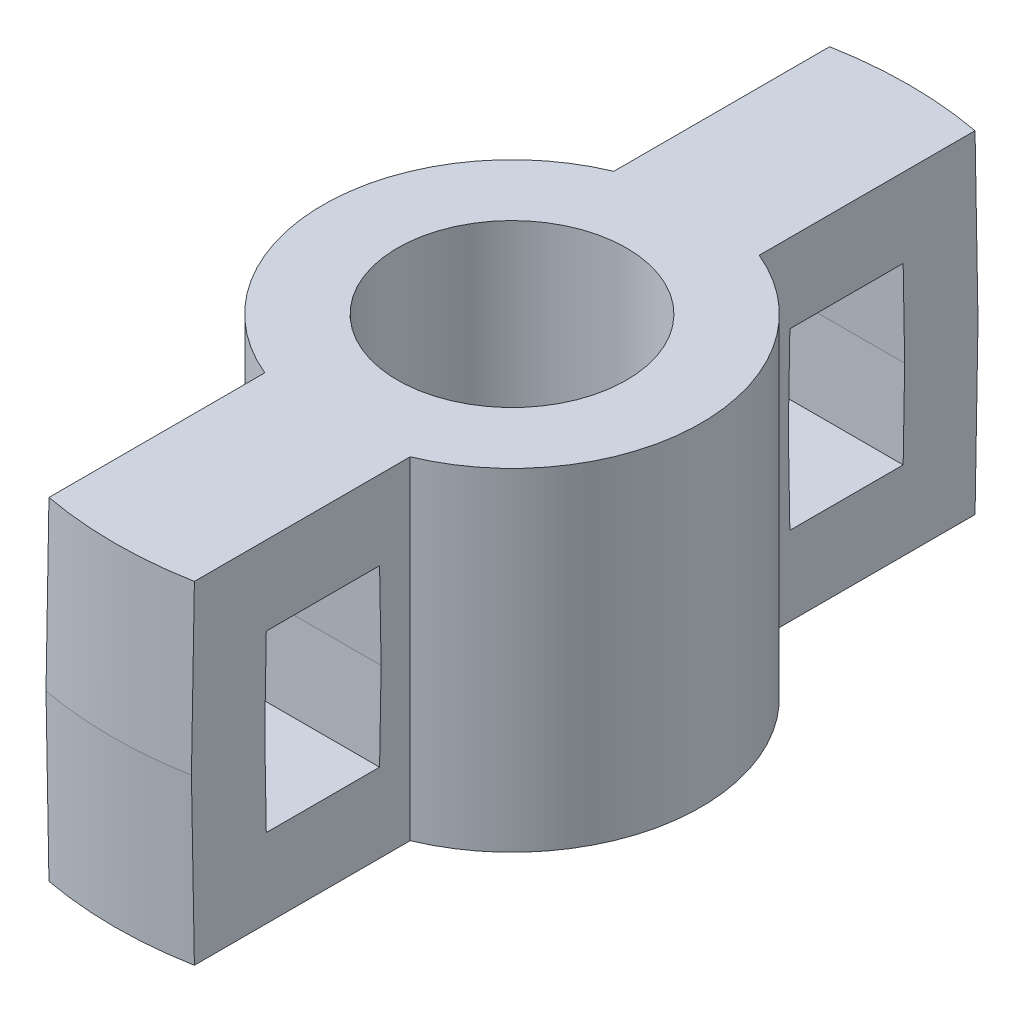
ISO-10303-21;
HEADER;
FILE_DESCRIPTION(('STEP AP214'),'2;1');
FILE_NAME('part.step','',(''),(''),'','','');
FILE_SCHEMA(('AUTOMOTIVE_DESIGN { 1 0 10303 214 1 1 1 1 }'));
ENDSEC;
DATA;
#1=APPLICATION_CONTEXT('core data for automotive mechanical design processes');
#2=APPLICATION_PROTOCOL_DEFINITION('international standard','automotive_design',2000,#1);
#3=PRODUCT_CONTEXT('',#1,'mechanical');
#4=PRODUCT('Part','Part','',(#3));
#5=PRODUCT_RELATED_PRODUCT_CATEGORY('part','',(#4));
#6=PRODUCT_DEFINITION_FORMATION('','',#4);
#7=PRODUCT_DEFINITION_CONTEXT('part definition',#1,'design');
#8=PRODUCT_DEFINITION('design','',#6,#7);
#9=PRODUCT_DEFINITION_SHAPE('','',#8);
#10=(LENGTH_UNIT() NAMED_UNIT(*) SI_UNIT(.MILLI.,.METRE.));
#11=(NAMED_UNIT(*) PLANE_ANGLE_UNIT() SI_UNIT($,.RADIAN.));
#12=(NAMED_UNIT(*) SI_UNIT($,.STERADIAN.) SOLID_ANGLE_UNIT());
#13=UNCERTAINTY_MEASURE_WITH_UNIT(LENGTH_MEASURE(1.E-05),#10,'distance_accuracy_value','');
#14=(GEOMETRIC_REPRESENTATION_CONTEXT(3) GLOBAL_UNCERTAINTY_ASSIGNED_CONTEXT((#13)) GLOBAL_UNIT_ASSIGNED_CONTEXT((#10,
#11,#12)) REPRESENTATION_CONTEXT('',''));
#15=CARTESIAN_POINT('',(0.,0.,0.));
#16=DIRECTION('',(0.,0.,1.));
#17=DIRECTION('',(1.,0.,0.));
#18=AXIS2_PLACEMENT_3D('',#15,#16,#17);
#19=CARTESIAN_POINT('',(-2.6,1.2,-4.37905392208613));
#20=DIRECTION('',(0.,0.0174524064372886,-0.999847695156391));
#21=DIRECTION('',(0.,0.999847695156391,0.0174524064372886));
#22=AXIS2_PLACEMENT_3D('',#19,#20,#21);
#23=PLANE('',#22);
#24=DIRECTION('',(1.,0.,0.));
#25=VECTOR('',#24,1.);
#26=CARTESIAN_POINT('',(-2.6,1.2,-4.37905392208613));
#27=LINE('',#26,#25);
#28=CARTESIAN_POINT('',(0.999999999999999,1.2,-4.37905392208613));
#29=VERTEX_POINT('',#28);
#30=CARTESIAN_POINT('',(-1.,1.2,-4.37905392208613));
#31=VERTEX_POINT('',#30);
#32=EDGE_CURVE('E300',#29,#31,#27,.F.);
#33=ORIENTED_EDGE('',*,*,#32,.T.);
#34=DIRECTION('',(0.,0.999847695156391,0.0174524064372886));
#35=VECTOR('',#34,1.);
#36=CARTESIAN_POINT('',(-1.,1.2,-4.37905392208613));
#37=LINE('',#36,#35);
#38=CARTESIAN_POINT('',(-1.,0.,-4.4));
#39=VERTEX_POINT('',#38);
#40=EDGE_CURVE('E328',#39,#31,#37,.T.);
#41=ORIENTED_EDGE('',*,*,#40,.F.);
#42=DIRECTION('',(1.,0.,0.));
#43=VECTOR('',#42,1.);
#44=CARTESIAN_POINT('',(-2.6,0.,-4.4));
#45=LINE('',#44,#43);
#46=CARTESIAN_POINT('',(1.,0.,-4.4));
#47=VERTEX_POINT('',#46);
#48=EDGE_CURVE('E280',#39,#47,#45,.T.);
#49=ORIENTED_EDGE('',*,*,#48,.T.);
#50=DIRECTION('',(0.,0.999847695156391,0.0174524064372886));
#51=VECTOR('',#50,1.);
#52=CARTESIAN_POINT('',(1.,1.2,-4.37905392208613));
#53=LINE('',#52,#51);
#54=EDGE_CURVE('E315',#29,#47,#53,.F.);
#55=ORIENTED_EDGE('',*,*,#54,.F.);
#56=EDGE_LOOP('',(#33,#41,#49,#55));
#57=FACE_BOUND('',#56,.T.);
#58=ADVANCED_FACE('F16',(#57),#23,.F.);
#59=CARTESIAN_POINT('',(-2.6,0.,2.8));
#60=DIRECTION('',(0.,0.0174524064372871,-0.999847695156391));
#61=DIRECTION('',(0.,0.999847695156391,0.0174524064372871));
#62=AXIS2_PLACEMENT_3D('',#59,#60,#61);
#63=PLANE('',#62);
#64=DIRECTION('',(1.,0.,0.));
#65=VECTOR('',#64,1.);
#66=CARTESIAN_POINT('',(-2.6,0.,2.8));
#67=LINE('',#66,#65);
#68=CARTESIAN_POINT('',(-1.,0.,2.8));
#69=VERTEX_POINT('',#68);
#70=CARTESIAN_POINT('',(0.999999999999995,0.,2.8));
#71=VERTEX_POINT('',#70);
#72=EDGE_CURVE('E274',#69,#71,#67,.T.);
#73=ORIENTED_EDGE('',*,*,#72,.T.);
#74=DIRECTION('',(0.,0.999847695156391,0.0174524064372871));
#75=VECTOR('',#74,1.);
#76=CARTESIAN_POINT('',(0.999999999999995,0.,2.8));
#77=LINE('',#76,#75);
#78=CARTESIAN_POINT('',(0.999999999999997,1.2,2.82094607791387));
#79=VERTEX_POINT('',#78);
#80=EDGE_CURVE('E310',#79,#71,#77,.F.);
#81=ORIENTED_EDGE('',*,*,#80,.F.);
#82=DIRECTION('',(1.,0.,0.));
#83=VECTOR('',#82,1.);
#84=CARTESIAN_POINT('',(-2.6,1.2,2.82094607791387));
#85=LINE('',#84,#83);
#86=CARTESIAN_POINT('',(-1.,1.2,2.82094607791387));
#87=VERTEX_POINT('',#86);
#88=EDGE_CURVE('E258',#79,#87,#85,.F.);
#89=ORIENTED_EDGE('',*,*,#88,.T.);
#90=DIRECTION('',(0.,0.999847695156391,0.0174524064372871));
#91=VECTOR('',#90,1.);
#92=CARTESIAN_POINT('',(-1.,0.,2.8));
#93=LINE('',#92,#91);
#94=EDGE_CURVE('E307',#69,#87,#93,.T.);
#95=ORIENTED_EDGE('',*,*,#94,.F.);
#96=EDGE_LOOP('',(#73,#81,#89,#95));
#97=FACE_BOUND('',#96,.T.);
#98=ADVANCED_FACE('F644',(#97),#63,.F.);
#99=CARTESIAN_POINT('',(-2.6,1.2,-2.82094607791387));
#100=DIRECTION('',(0.,1.,0.));
#101=DIRECTION('',(0.,0.,1.));
#102=AXIS2_PLACEMENT_3D('',#99,#100,#101);
#103=PLANE('',#102);
#104=DIRECTION('',(1.,0.,0.));
#105=VECTOR('',#104,1.);
#106=CARTESIAN_POINT('',(-2.6,1.2,-2.82094607791387));
#107=LINE('',#106,#105);
#108=CARTESIAN_POINT('',(0.999999999999996,1.2,-2.82094607791387));
#109=VERTEX_POINT('',#108);
#110=CARTESIAN_POINT('',(-1.,1.2,-2.82094607791387));
#111=VERTEX_POINT('',#110);
#112=EDGE_CURVE('E244',#109,#111,#107,.F.);
#113=ORIENTED_EDGE('',*,*,#112,.T.);
#114=DIRECTION('',(0.,0.,1.));
#115=VECTOR('',#114,1.);
#116=CARTESIAN_POINT('',(-1.,1.2,-2.82094607791387));
#117=LINE('',#116,#115);
#118=EDGE_CURVE('E295',#31,#111,#117,.T.);
#119=ORIENTED_EDGE('',*,*,#118,.F.);
#120=ORIENTED_EDGE('',*,*,#32,.F.);
#121=DIRECTION('',(0.,0.,1.));
#122=VECTOR('',#121,1.);
#123=CARTESIAN_POINT('',(0.999999999999997,1.2,-2.82094607791387));
#124=LINE('',#123,#122);
#125=EDGE_CURVE('E281',#109,#29,#124,.F.);
#126=ORIENTED_EDGE('',*,*,#125,.F.);
#127=EDGE_LOOP('',(#113,#119,#120,#126));
#128=FACE_BOUND('',#127,.T.);
#129=ADVANCED_FACE('F635',(#128),#103,.F.);
#130=CARTESIAN_POINT('',(-2.6,-1.2,-4.37905392208613));
#131=DIRECTION('',(0.,-0.0174524064372886,-0.999847695156391));
#132=DIRECTION('',(0.,0.999847695156391,-0.0174524064372886));
#133=AXIS2_PLACEMENT_3D('',#130,#131,#132);
#134=PLANE('',#133);
#135=ORIENTED_EDGE('',*,*,#48,.F.);
#136=DIRECTION('',(0.,0.999847695156391,-0.0174524064372886));
#137=VECTOR('',#136,1.);
#138=CARTESIAN_POINT('',(-1.,-1.2,-4.37905392208613));
#139=LINE('',#138,#137);
#140=CARTESIAN_POINT('',(-1.,-1.2,-4.37905392208613));
#141=VERTEX_POINT('',#140);
#142=EDGE_CURVE('E277',#141,#39,#139,.T.);
#143=ORIENTED_EDGE('',*,*,#142,.F.);
#144=DIRECTION('',(1.,0.,0.));
#145=VECTOR('',#144,1.);
#146=CARTESIAN_POINT('',(-2.6,-1.2,-4.37905392208613));
#147=LINE('',#146,#145);
#148=CARTESIAN_POINT('',(0.999999999999998,-1.2,-4.37905392208613));
#149=VERTEX_POINT('',#148);
#150=EDGE_CURVE('E225',#141,#149,#147,.T.);
#151=ORIENTED_EDGE('',*,*,#150,.T.);
#152=DIRECTION('',(0.,0.999847695156391,-0.0174524064372886));
#153=VECTOR('',#152,1.);
#154=CARTESIAN_POINT('',(1.,-1.2,-4.37905392208613));
#155=LINE('',#154,#153);
#156=EDGE_CURVE('E284',#47,#149,#155,.F.);
#157=ORIENTED_EDGE('',*,*,#156,.F.);
#158=EDGE_LOOP('',(#135,#143,#151,#157));
#159=FACE_BOUND('',#158,.T.);
#160=ADVANCED_FACE('F626',(#159),#134,.F.);
#161=CARTESIAN_POINT('',(-2.6,0.,2.8));
#162=DIRECTION('',(0.,-0.0174524064372868,-0.999847695156391));
#163=DIRECTION('',(0.,0.999847695156391,-0.0174524064372868));
#164=AXIS2_PLACEMENT_3D('',#161,#162,#163);
#165=PLANE('',#164);
#166=DIRECTION('',(1.,0.,0.));
#167=VECTOR('',#166,1.);
#168=CARTESIAN_POINT('',(-2.6,-1.2,2.82094607791386));
#169=LINE('',#168,#167);
#170=CARTESIAN_POINT('',(-1.,-1.2,2.82094607791387));
#171=VERTEX_POINT('',#170);
#172=CARTESIAN_POINT('',(0.999999999999997,-1.2,2.82094607791387));
#173=VERTEX_POINT('',#172);
#174=EDGE_CURVE('E207',#171,#173,#169,.T.);
#175=ORIENTED_EDGE('',*,*,#174,.T.);
#176=DIRECTION('',(0.,0.999847695156391,-0.0174524064372868));
#177=VECTOR('',#176,1.);
#178=CARTESIAN_POINT('',(0.999999999999996,0.,2.8));
#179=LINE('',#178,#177);
#180=EDGE_CURVE('E269',#71,#173,#179,.F.);
#181=ORIENTED_EDGE('',*,*,#180,.F.);
#182=ORIENTED_EDGE('',*,*,#72,.F.);
#183=DIRECTION('',(0.,0.999847695156391,-0.0174524064372868));
#184=VECTOR('',#183,1.);
#185=CARTESIAN_POINT('',(-1.,0.,2.8));
#186=LINE('',#185,#184);
#187=EDGE_CURVE('E264',#171,#69,#186,.T.);
#188=ORIENTED_EDGE('',*,*,#187,.F.);
#189=EDGE_LOOP('',(#175,#181,#182,#188));
#190=FACE_BOUND('',#189,.T.);
#191=ADVANCED_FACE('F617',(#190),#165,.F.);
#192=CARTESIAN_POINT('',(-2.6,1.2,2.82094607791387));
#193=DIRECTION('',(0.,1.,0.));
#194=DIRECTION('',(0.,0.,1.));
#195=AXIS2_PLACEMENT_3D('',#192,#193,#194);
#196=PLANE('',#195);
#197=ORIENTED_EDGE('',*,*,#88,.F.);
#198=DIRECTION('',(0.,0.,1.));
#199=VECTOR('',#198,1.);
#200=CARTESIAN_POINT('',(0.999999999999997,1.2,2.82094607791387));
#201=LINE('',#200,#199);
#202=CARTESIAN_POINT('',(0.999999999999999,1.2,4.37905392208613));
#203=VERTEX_POINT('',#202);
#204=EDGE_CURVE('E261',#203,#79,#201,.F.);
#205=ORIENTED_EDGE('',*,*,#204,.F.);
#206=DIRECTION('',(1.,0.,0.));
#207=VECTOR('',#206,1.);
#208=CARTESIAN_POINT('',(-2.6,1.2,4.37905392208613));
#209=LINE('',#208,#207);
#210=CARTESIAN_POINT('',(-1.,1.2,4.37905392208613));
#211=VERTEX_POINT('',#210);
#212=EDGE_CURVE('E197',#203,#211,#209,.F.);
#213=ORIENTED_EDGE('',*,*,#212,.T.);
#214=DIRECTION('',(0.,0.,1.));
#215=VECTOR('',#214,1.);
#216=CARTESIAN_POINT('',(-1.,1.2,2.82094607791387));
#217=LINE('',#216,#215);
#218=EDGE_CURVE('E255',#87,#211,#217,.T.);
#219=ORIENTED_EDGE('',*,*,#218,.F.);
#220=EDGE_LOOP('',(#197,#205,#213,#219));
#221=FACE_BOUND('',#220,.T.);
#222=ADVANCED_FACE('F608',(#221),#196,.F.);
#223=CARTESIAN_POINT('',(-2.6,0.,-2.8));
#224=DIRECTION('',(0.,0.0174524064372871,0.999847695156391));
#225=DIRECTION('',(0.,-0.999847695156391,0.0174524064372871));
#226=AXIS2_PLACEMENT_3D('',#223,#224,#225);
#227=PLANE('',#226);
#228=DIRECTION('',(1.,0.,0.));
#229=VECTOR('',#228,1.);
#230=CARTESIAN_POINT('',(-2.6,0.,-2.8));
#231=LINE('',#230,#229);
#232=CARTESIAN_POINT('',(0.999999999999995,0.,-2.8));
#233=VERTEX_POINT('',#232);
#234=CARTESIAN_POINT('',(-1.,0.,-2.8));
#235=VERTEX_POINT('',#234);
#236=EDGE_CURVE('E178',#233,#235,#231,.F.);
#237=ORIENTED_EDGE('',*,*,#236,.T.);
#238=DIRECTION('',(0.,-0.999847695156391,0.0174524064372871));
#239=VECTOR('',#238,1.);
#240=CARTESIAN_POINT('',(-1.,0.,-2.8));
#241=LINE('',#240,#239);
#242=EDGE_CURVE('E239',#111,#235,#241,.T.);
#243=ORIENTED_EDGE('',*,*,#242,.F.);
#244=ORIENTED_EDGE('',*,*,#112,.F.);
#245=DIRECTION('',(0.,-0.999847695156391,0.0174524064372871));
#246=VECTOR('',#245,1.);
#247=CARTESIAN_POINT('',(0.999999999999996,0.,-2.8));
#248=LINE('',#247,#246);
#249=EDGE_CURVE('E236',#233,#109,#248,.F.);
#250=ORIENTED_EDGE('',*,*,#249,.F.);
#251=EDGE_LOOP('',(#237,#243,#244,#250));
#252=FACE_BOUND('',#251,.T.);
#253=ADVANCED_FACE('F599',(#252),#227,.F.);
#254=CARTESIAN_POINT('',(-2.6,-1.2,-2.82094607791387));
#255=DIRECTION('',(0.,-1.,0.));
#256=DIRECTION('',(0.,0.,-1.));
#257=AXIS2_PLACEMENT_3D('',#254,#255,#256);
#258=PLANE('',#257);
#259=ORIENTED_EDGE('',*,*,#150,.F.);
#260=DIRECTION('',(0.,0.,1.));
#261=VECTOR('',#260,1.);
#262=CARTESIAN_POINT('',(-0.999999999999998,-1.2,-5.40832691319598));
#263=LINE('',#262,#261);
#264=CARTESIAN_POINT('',(-1.,-1.2,-2.82094607791387));
#265=VERTEX_POINT('',#264);
#266=EDGE_CURVE('E124',#265,#141,#263,.F.);
#267=ORIENTED_EDGE('',*,*,#266,.F.);
#268=DIRECTION('',(1.,0.,0.));
#269=VECTOR('',#268,1.);
#270=CARTESIAN_POINT('',(-2.6,-1.2,-2.82094607791387));
#271=LINE('',#270,#269);
#272=CARTESIAN_POINT('',(0.999999999999996,-1.2,-2.82094607791387));
#273=VERTEX_POINT('',#272);
#274=EDGE_CURVE('E177',#265,#273,#271,.T.);
#275=ORIENTED_EDGE('',*,*,#274,.T.);
#276=DIRECTION('',(0.,0.,-1.));
#277=VECTOR('',#276,1.);
#278=CARTESIAN_POINT('',(0.999999999999997,-1.2,-2.82094607791387));
#279=LINE('',#278,#277);
#280=EDGE_CURVE('E222',#149,#273,#279,.F.);
#281=ORIENTED_EDGE('',*,*,#280,.F.);
#282=EDGE_LOOP('',(#259,#267,#275,#281));
#283=FACE_BOUND('',#282,.T.);
#284=ADVANCED_FACE('F591',(#283),#258,.F.);
#285=CARTESIAN_POINT('',(-2.6,-1.2,2.82094607791386));
#286=DIRECTION('',(0.,-1.,0.));
#287=DIRECTION('',(0.,0.,-1.));
#288=AXIS2_PLACEMENT_3D('',#285,#286,#287);
#289=PLANE('',#288);
#290=DIRECTION('',(1.,0.,0.));
#291=VECTOR('',#290,1.);
#292=CARTESIAN_POINT('',(-2.6,-1.2,4.37905392208613));
#293=LINE('',#292,#291);
#294=CARTESIAN_POINT('',(-1.,-1.2,4.37905392208613));
#295=VERTEX_POINT('',#294);
#296=CARTESIAN_POINT('',(0.999999999999999,-1.2,4.37905392208613));
#297=VERTEX_POINT('',#296);
#298=EDGE_CURVE('E155',#295,#297,#293,.T.);
#299=ORIENTED_EDGE('',*,*,#298,.T.);
#300=DIRECTION('',(0.,0.,-1.));
#301=VECTOR('',#300,1.);
#302=CARTESIAN_POINT('',(0.999999999999997,-1.2,2.82094607791386));
#303=LINE('',#302,#301);
#304=EDGE_CURVE('E198',#173,#297,#303,.F.);
#305=ORIENTED_EDGE('',*,*,#304,.F.);
#306=ORIENTED_EDGE('',*,*,#174,.F.);
#307=DIRECTION('',(0.,0.,1.));
#308=VECTOR('',#307,1.);
#309=CARTESIAN_POINT('',(-1.00000000000001,-1.2,2.4));
#310=LINE('',#309,#308);
#311=EDGE_CURVE('E123',#295,#171,#310,.F.);
#312=ORIENTED_EDGE('',*,*,#311,.F.);
#313=EDGE_LOOP('',(#299,#305,#306,#312));
#314=FACE_BOUND('',#313,.T.);
#315=ADVANCED_FACE('F583',(#314),#289,.F.);
#316=CARTESIAN_POINT('',(-2.6,1.2,4.37905392208613));
#317=DIRECTION('',(0.,0.0174524064372886,0.999847695156391));
#318=DIRECTION('',(0.,-0.999847695156391,0.0174524064372886));
#319=AXIS2_PLACEMENT_3D('',#316,#317,#318);
#320=PLANE('',#319);
#321=ORIENTED_EDGE('',*,*,#212,.F.);
#322=DIRECTION('',(0.,-0.999847695156391,0.0174524064372886));
#323=VECTOR('',#322,1.);
#324=CARTESIAN_POINT('',(1.,1.2,4.37905392208613));
#325=LINE('',#324,#323);
#326=CARTESIAN_POINT('',(1.,0.,4.4));
#327=VERTEX_POINT('',#326);
#328=EDGE_CURVE('E194',#327,#203,#325,.F.);
#329=ORIENTED_EDGE('',*,*,#328,.F.);
#330=DIRECTION('',(1.,0.,0.));
#331=VECTOR('',#330,1.);
#332=CARTESIAN_POINT('',(-2.6,0.,4.4));
#333=LINE('',#332,#331);
#334=CARTESIAN_POINT('',(-1.,0.,4.4));
#335=VERTEX_POINT('',#334);
#336=EDGE_CURVE('E152',#327,#335,#333,.F.);
#337=ORIENTED_EDGE('',*,*,#336,.T.);
#338=DIRECTION('',(0.,-0.999847695156391,0.0174524064372886));
#339=VECTOR('',#338,1.);
#340=CARTESIAN_POINT('',(-1.,1.2,4.37905392208613));
#341=LINE('',#340,#339);
#342=EDGE_CURVE('E160',#211,#335,#341,.T.);
#343=ORIENTED_EDGE('',*,*,#342,.F.);
#344=EDGE_LOOP('',(#321,#329,#337,#343));
#345=FACE_BOUND('',#344,.T.);
#346=ADVANCED_FACE('F408',(#345),#320,.F.);
#347=CARTESIAN_POINT('',(0.,-1.70530256582424E-10,0.));
#348=DIRECTION('',(0.,1.,0.));
#349=DIRECTION('',(0.,0.,1.));
#350=AXIS2_PLACEMENT_3D('',#347,#348,#349);
#351=CONICAL_SURFACE('',#350,5.49999999999784,0.0174532925207443);
#352=CARTESIAN_POINT('',(0.,0.,0.));
#353=DIRECTION('',(0.,-1.,0.));
#354=DIRECTION('',(0.,0.,1.));
#355=AXIS2_PLACEMENT_3D('',#352,#353,#354);
#356=CIRCLE('',#355,5.49999999999962);
#357=CARTESIAN_POINT('',(1.,0.,-5.4083269131962));
#358=VERTEX_POINT('',#357);
#359=CARTESIAN_POINT('',(-0.999999999999998,0.,-5.4083269131962));
#360=VERTEX_POINT('',#359);
#361=EDGE_CURVE('E173',#358,#360,#356,.F.);
#362=ORIENTED_EDGE('',*,*,#361,.F.);
#363=CARTESIAN_POINT('',(1.,-2.28600000000527,-5.3677432063323));
#364=CARTESIAN_POINT('',(1.,-1.90500001505893,-5.37450800546877));
#365=CARTESIAN_POINT('',(1.,-1.52400002258532,-5.38127238060905));
#366=CARTESIAN_POINT('',(1.,-0.762000022583569,-5.39480028289722));
#367=CARTESIAN_POINT('',(1.,-0.381000015055424,-5.40156381004511));
#368=CARTESIAN_POINT('',(1.,0.,-5.40832691319681));
#369=B_SPLINE_CURVE_WITH_KNOTS('',3,(#363,#364,#365,#366,#367,#368),.UNSPECIFIED.,.F.,.F.,(4,2,
4),(0.,1.14318010799846,2.2863602159969),.UNSPECIFIED.);
#370=CARTESIAN_POINT('',(1.,-2.28600000001585,-5.36774320633211));
#371=VERTEX_POINT('',#370);
#372=EDGE_CURVE('E170',#371,#358,#369,.T.);
#373=ORIENTED_EDGE('',*,*,#372,.F.);
#374=CARTESIAN_POINT('',(0.,-2.28600000002643,0.));
#375=DIRECTION('',(0.,1.,0.));
#376=DIRECTION('',(0.,0.,1.));
#377=AXIS2_PLACEMENT_3D('',#374,#375,#376);
#378=CIRCLE('',#377,5.46009772157262);
#379=CARTESIAN_POINT('',(-0.999999999999998,-2.28600000002114,-5.36774320633202));
#380=VERTEX_POINT('',#379);
#381=EDGE_CURVE('E115',#371,#380,#378,.T.);
#382=ORIENTED_EDGE('',*,*,#381,.T.);
#383=CARTESIAN_POINT('',(-0.999999999999998,-2.28600000001584,-5.36774320633211));
#384=CARTESIAN_POINT('',(-0.999999999999998,-1.90500001506774,-5.37450800546861));
#385=CARTESIAN_POINT('',(-0.999999999999998,-1.52400002259237,-5.38127238060892));
#386=CARTESIAN_POINT('',(-0.999999999999998,-0.762000022587093,-5.39480028289716));
#387=CARTESIAN_POINT('',(-0.999999999999998,-0.381000015057188,-5.40156381004508));
#388=CARTESIAN_POINT('',(-0.999999999999998,0.,-5.40832691319681));
#389=B_SPLINE_CURVE_WITH_KNOTS('',3,(#383,#384,#385,#386,#387,#388),.UNSPECIFIED.,.F.,.F.,(4,2,
4),(0.,1.14318010800374,2.28636021600747),.UNSPECIFIED.);
#390=EDGE_CURVE('E182',#380,#360,#389,.T.);
#391=ORIENTED_EDGE('',*,*,#390,.T.);
#392=EDGE_LOOP('',(#362,#373,#382,#391));
#393=FACE_BOUND('',#392,.T.);
#394=ADVANCED_FACE('F403',(#393),#351,.T.);
#395=CARTESIAN_POINT('',(-2.6,0.,-2.8));
#396=DIRECTION('',(0.,-0.0174524064372875,0.999847695156391));
#397=DIRECTION('',(0.,-0.999847695156391,-0.0174524064372875));
#398=AXIS2_PLACEMENT_3D('',#395,#396,#397);
#399=PLANE('',#398);
#400=ORIENTED_EDGE('',*,*,#274,.F.);
#401=DIRECTION('',(0.,-0.999847695156391,-0.0174524064372875));
#402=VECTOR('',#401,1.);
#403=CARTESIAN_POINT('',(-1.,0.,-2.8));
#404=LINE('',#403,#402);
#405=EDGE_CURVE('E181',#235,#265,#404,.T.);
#406=ORIENTED_EDGE('',*,*,#405,.F.);
#407=ORIENTED_EDGE('',*,*,#236,.F.);
#408=DIRECTION('',(0.,0.999847695156391,0.0174524064372875));
#409=VECTOR('',#408,1.);
#410=CARTESIAN_POINT('',(0.999999999999995,-1.2,-2.82094607791387));
#411=LINE('',#410,#409);
#412=EDGE_CURVE('E167',#273,#233,#411,.T.);
#413=ORIENTED_EDGE('',*,*,#412,.F.);
#414=EDGE_LOOP('',(#400,#406,#407,#413));
#415=FACE_BOUND('',#414,.T.);
#416=ADVANCED_FACE('F407',(#415),#399,.F.);
#417=CARTESIAN_POINT('',(0.,1.70530256582424E-10,0.));
#418=DIRECTION('',(0.,-1.,0.));
#419=DIRECTION('',(0.,0.,-1.));
#420=AXIS2_PLACEMENT_3D('',#417,#418,#419);
#421=CONICAL_SURFACE('',#420,5.49999999999784,0.0174532925207443);
#422=CARTESIAN_POINT('',(-0.999999999999998,2.28600000000527,-5.3677432063323));
#423=CARTESIAN_POINT('',(-0.999999999999998,1.90500001505893,-5.37450800546877));
#424=CARTESIAN_POINT('',(-0.999999999999998,1.52400002258532,-5.38127238060905));
#425=CARTESIAN_POINT('',(-0.999999999999998,0.762000022583568,-5.39480028289722));
#426=CARTESIAN_POINT('',(-0.999999999999998,0.381000015055424,-5.40156381004511));
#427=CARTESIAN_POINT('',(-0.999999999999998,0.,-5.40832691319681));
#428=B_SPLINE_CURVE_WITH_KNOTS('',3,(#422,#423,#424,#425,#426,#427),.UNSPECIFIED.,.F.,.F.,(4,2,
4),(0.,1.14318010799846,2.2863602159969),.UNSPECIFIED.);
#429=CARTESIAN_POINT('',(-0.999999999999998,2.28600000001585,-5.36774320633211));
#430=VERTEX_POINT('',#429);
#431=EDGE_CURVE('E176',#430,#360,#428,.T.);
#432=ORIENTED_EDGE('',*,*,#431,.F.);
#433=CARTESIAN_POINT('',(0.,2.28600000002643,0.));
#434=DIRECTION('',(0.,-1.,0.));
#435=DIRECTION('',(0.,0.,-1.));
#436=AXIS2_PLACEMENT_3D('',#433,#434,#435);
#437=CIRCLE('',#436,5.46009772157262);
#438=CARTESIAN_POINT('',(1.,2.28600000001585,-5.36774320633211));
#439=VERTEX_POINT('',#438);
#440=EDGE_CURVE('E473',#439,#430,#437,.F.);
#441=ORIENTED_EDGE('',*,*,#440,.F.);
#442=CARTESIAN_POINT('',(1.,0.,-5.40832691319681));
#443=CARTESIAN_POINT('',(1.,0.381000015055425,-5.40156381004511));
#444=CARTESIAN_POINT('',(1.,0.762000022583569,-5.39480028289722));
#445=CARTESIAN_POINT('',(1.,1.52400002258532,-5.38127238060905));
#446=CARTESIAN_POINT('',(1.,1.90500001505893,-5.37450800546877));
#447=CARTESIAN_POINT('',(1.,2.28600000000527,-5.3677432063323));
#448=B_SPLINE_CURVE_WITH_KNOTS('',3,(#442,#443,#444,#445,#446,#447),.UNSPECIFIED.,.F.,.F.,(4,2,
4),(0.,1.14318010799844,2.2863602159969),.UNSPECIFIED.);
#449=EDGE_CURVE('E420',#358,#439,#448,.T.);
#450=ORIENTED_EDGE('',*,*,#449,.F.);
#451=ORIENTED_EDGE('',*,*,#361,.T.);
#452=EDGE_LOOP('',(#432,#441,#450,#451));
#453=FACE_BOUND('',#452,.T.);
#454=ADVANCED_FACE('F394',(#453),#421,.T.);
#455=CARTESIAN_POINT('',(-0.999999999999998,-5.97517334913935,-5.40832691319598));
#456=DIRECTION('',(-1.,0.,0.));
#457=DIRECTION('',(0.,0.,1.));
#458=AXIS2_PLACEMENT_3D('',#455,#456,#457);
#459=PLANE('',#458);
#460=DIRECTION('',(0.,-1.,0.));
#461=VECTOR('',#460,1.);
#462=CARTESIAN_POINT('',(-1.,2.286,-2.4));
#463=LINE('',#462,#461);
#464=CARTESIAN_POINT('',(-1.,2.286,-2.4));
#465=VERTEX_POINT('',#464);
#466=CARTESIAN_POINT('',(-1.,-2.286,-2.4));
#467=VERTEX_POINT('',#466);
#468=EDGE_CURVE('E189',#465,#467,#463,.T.);
#469=ORIENTED_EDGE('',*,*,#468,.F.);
#470=DIRECTION('',(0.,0.,1.));
#471=VECTOR('',#470,1.);
#472=CARTESIAN_POINT('',(-0.999999999999998,2.286,0.));
#473=LINE('',#472,#471);
#474=EDGE_CURVE('E471',#430,#465,#473,.T.);
#475=ORIENTED_EDGE('',*,*,#474,.F.);
#476=ORIENTED_EDGE('',*,*,#431,.T.);
#477=ORIENTED_EDGE('',*,*,#390,.F.);
#478=DIRECTION('',(0.,0.,1.));
#479=VECTOR('',#478,1.);
#480=CARTESIAN_POINT('',(-0.999999999999998,-2.286,0.));
#481=LINE('',#480,#479);
#482=EDGE_CURVE('E132',#380,#467,#481,.T.);
#483=ORIENTED_EDGE('',*,*,#482,.T.);
#484=EDGE_LOOP('',(#469,#475,#476,#477,#483));
#485=FACE_BOUND('',#484,.T.);
#486=ORIENTED_EDGE('',*,*,#118,.T.);
#487=ORIENTED_EDGE('',*,*,#242,.T.);
#488=ORIENTED_EDGE('',*,*,#405,.T.);
#489=ORIENTED_EDGE('',*,*,#266,.T.);
#490=ORIENTED_EDGE('',*,*,#142,.T.);
#491=ORIENTED_EDGE('',*,*,#40,.T.);
#492=EDGE_LOOP('',(#486,#487,#488,#489,#490,#491));
#493=FACE_BOUND('',#492,.T.);
#494=ADVANCED_FACE('F390',(#485,#493),#459,.T.);
#495=CARTESIAN_POINT('',(0.,2.286,0.));
#496=DIRECTION('',(0.,-1.,0.));
#497=DIRECTION('',(0.,0.,-1.));
#498=AXIS2_PLACEMENT_3D('',#495,#496,#497);
#499=CYLINDRICAL_SURFACE('',#498,2.6);
#500=CARTESIAN_POINT('',(0.,-2.286,0.));
#501=DIRECTION('',(0.,-1.,0.));
#502=DIRECTION('',(0.,0.,-1.));
#503=AXIS2_PLACEMENT_3D('',#500,#501,#502);
#504=CIRCLE('',#503,2.6);
#505=CARTESIAN_POINT('',(-1.00000000000001,-2.286,2.4));
#506=VERTEX_POINT('',#505);
#507=EDGE_CURVE('E130',#467,#506,#504,.F.);
#508=ORIENTED_EDGE('',*,*,#507,.T.);
#509=DIRECTION('',(0.,1.,0.));
#510=VECTOR('',#509,1.);
#511=CARTESIAN_POINT('',(-1.00000000000001,-5.97517334913935,2.4));
#512=LINE('',#511,#510);
#513=CARTESIAN_POINT('',(-1.00000000000001,2.286,2.4));
#514=VERTEX_POINT('',#513);
#515=EDGE_CURVE('E128',#514,#506,#512,.F.);
#516=ORIENTED_EDGE('',*,*,#515,.F.);
#517=CARTESIAN_POINT('',(0.,2.286,0.));
#518=DIRECTION('',(0.,-1.,0.));
#519=DIRECTION('',(0.,0.,-1.));
#520=AXIS2_PLACEMENT_3D('',#517,#518,#519);
#521=CIRCLE('',#520,2.6);
#522=EDGE_CURVE('E470',#465,#514,#521,.F.);
#523=ORIENTED_EDGE('',*,*,#522,.F.);
#524=ORIENTED_EDGE('',*,*,#468,.T.);
#525=EDGE_LOOP('',(#508,#516,#523,#524));
#526=FACE_BOUND('',#525,.T.);
#527=ADVANCED_FACE('F387',(#526),#499,.T.);
#528=CARTESIAN_POINT('',(-1.00000000000001,-5.97517334913935,2.4));
#529=DIRECTION('',(-1.,0.,0.));
#530=DIRECTION('',(0.,0.,1.));
#531=AXIS2_PLACEMENT_3D('',#528,#529,#530);
#532=PLANE('',#531);
#533=CARTESIAN_POINT('',(-0.999999999999998,-2.28600000000527,5.3677432063323));
#534=CARTESIAN_POINT('',(-0.999999999999998,-1.90500001505893,5.37450800546877));
#535=CARTESIAN_POINT('',(-0.999999999999998,-1.52400002258532,5.38127238060905));
#536=CARTESIAN_POINT('',(-0.999999999999998,-0.762000022583569,5.39480028289722));
#537=CARTESIAN_POINT('',(-0.999999999999998,-0.381000015055424,5.40156381004511));
#538=CARTESIAN_POINT('',(-0.999999999999998,0.,5.40832691319681));
#539=B_SPLINE_CURVE_WITH_KNOTS('',3,(#533,#534,#535,#536,#537,#538),.UNSPECIFIED.,.F.,.F.,(4,2,
4),(0.,1.14318010799846,2.2863602159969),.UNSPECIFIED.);
#540=CARTESIAN_POINT('',(-1.,-2.28600000001585,5.36774320633211));
#541=VERTEX_POINT('',#540);
#542=CARTESIAN_POINT('',(-0.999999999999998,0.,5.4083269131962));
#543=VERTEX_POINT('',#542);
#544=EDGE_CURVE('E19',#541,#543,#539,.T.);
#545=ORIENTED_EDGE('',*,*,#544,.T.);
#546=CARTESIAN_POINT('',(-0.999999999999998,0.,5.40832691319681));
#547=CARTESIAN_POINT('',(-0.999999999999998,0.381000015055424,5.40156381004511));
#548=CARTESIAN_POINT('',(-0.999999999999998,0.762000022583569,5.39480028289722));
#549=CARTESIAN_POINT('',(-0.999999999999998,1.52400002258532,5.38127238060905));
#550=CARTESIAN_POINT('',(-0.999999999999998,1.90500001505893,5.37450800546877));
#551=CARTESIAN_POINT('',(-0.999999999999998,2.28600000000527,5.3677432063323));
#552=B_SPLINE_CURVE_WITH_KNOTS('',3,(#546,#547,#548,#549,#550,#551),.UNSPECIFIED.,.F.,.F.,(4,2,
4),(0.,1.14318010799845,2.2863602159969),.UNSPECIFIED.);
#553=CARTESIAN_POINT('',(-1.,2.28600000001585,5.36774320633211));
#554=VERTEX_POINT('',#553);
#555=EDGE_CURVE('E164',#543,#554,#552,.T.);
#556=ORIENTED_EDGE('',*,*,#555,.T.);
#557=DIRECTION('',(0.,0.,1.));
#558=VECTOR('',#557,1.);
#559=CARTESIAN_POINT('',(-1.00000000000001,2.286,0.));
#560=LINE('',#559,#558);
#561=EDGE_CURVE('E466',#514,#554,#560,.T.);
#562=ORIENTED_EDGE('',*,*,#561,.F.);
#563=ORIENTED_EDGE('',*,*,#515,.T.);
#564=DIRECTION('',(0.,0.,1.));
#565=VECTOR('',#564,1.);
#566=CARTESIAN_POINT('',(-1.00000000000001,-2.286,0.));
#567=LINE('',#566,#565);
#568=EDGE_CURVE('E108',#506,#541,#567,.T.);
#569=ORIENTED_EDGE('',*,*,#568,.T.);
#570=EDGE_LOOP('',(#545,#556,#562,#563,#569));
#571=FACE_BOUND('',#570,.T.);
#572=ORIENTED_EDGE('',*,*,#218,.T.);
#573=ORIENTED_EDGE('',*,*,#342,.T.);
#574=DIRECTION('',(0.,-0.999847695156391,-0.0174524064372886));
#575=VECTOR('',#574,1.);
#576=CARTESIAN_POINT('',(-1.,-1.2,4.37905392208613));
#577=LINE('',#576,#575);
#578=EDGE_CURVE('E143',#335,#295,#577,.T.);
#579=ORIENTED_EDGE('',*,*,#578,.T.);
#580=ORIENTED_EDGE('',*,*,#311,.T.);
#581=ORIENTED_EDGE('',*,*,#187,.T.);
#582=ORIENTED_EDGE('',*,*,#94,.T.);
#583=EDGE_LOOP('',(#572,#573,#579,#580,#581,#582));
#584=FACE_BOUND('',#583,.T.);
#585=ADVANCED_FACE('F125',(#571,#584),#532,.T.);
#586=CARTESIAN_POINT('',(0.,2.286,0.));
#587=DIRECTION('',(0.,-1.,0.));
#588=DIRECTION('',(0.,0.,-1.));
#589=AXIS2_PLACEMENT_3D('',#586,#587,#588);
#590=CYLINDRICAL_SURFACE('',#589,1.575);
#591=CARTESIAN_POINT('',(0.,2.286,0.));
#592=DIRECTION('',(0.,-1.,0.));
#593=DIRECTION('',(0.,0.,-1.));
#594=AXIS2_PLACEMENT_3D('',#591,#592,#593);
#595=CIRCLE('',#594,1.575);
#596=CARTESIAN_POINT('',(0.,2.286,-1.575));
#597=VERTEX_POINT('',#596);
#598=EDGE_CURVE('E452',#597,#597,#595,.T.);
#599=ORIENTED_EDGE('',*,*,#598,.F.);
#600=EDGE_LOOP('',(#599));
#601=FACE_BOUND('',#600,.T.);
#602=CARTESIAN_POINT('',(0.,-2.286,0.));
#603=DIRECTION('',(0.,-1.,0.));
#604=DIRECTION('',(0.,0.,-1.));
#605=AXIS2_PLACEMENT_3D('',#602,#603,#604);
#606=CIRCLE('',#605,1.575);
#607=CARTESIAN_POINT('',(0.,-2.286,-1.575));
#608=VERTEX_POINT('',#607);
#609=EDGE_CURVE('E419',#608,#608,#606,.T.);
#610=ORIENTED_EDGE('',*,*,#609,.T.);
#611=EDGE_LOOP('',(#610));
#612=FACE_BOUND('',#611,.T.);
#613=ADVANCED_FACE('F371',(#601,#612),#590,.F.);
#614=CARTESIAN_POINT('',(0.,1.70530256582424E-10,0.));
#615=DIRECTION('',(0.,-1.,0.));
#616=DIRECTION('',(0.,0.,-1.));
#617=AXIS2_PLACEMENT_3D('',#614,#615,#616);
#618=CONICAL_SURFACE('',#617,5.49999999999784,0.0174532925207443);
#619=CARTESIAN_POINT('',(0.,0.,0.));
#620=DIRECTION('',(0.,1.,0.));
#621=DIRECTION('',(0.,0.,1.));
#622=AXIS2_PLACEMENT_3D('',#619,#620,#621);
#623=CIRCLE('',#622,5.49999999999962);
#624=CARTESIAN_POINT('',(1.,0.,5.4083269131962));
#625=VERTEX_POINT('',#624);
#626=EDGE_CURVE('E119',#625,#543,#623,.F.);
#627=ORIENTED_EDGE('',*,*,#626,.F.);
#628=CARTESIAN_POINT('',(1.,2.28600000000527,5.3677432063323));
#629=CARTESIAN_POINT('',(1.,1.90500001505893,5.37450800546877));
#630=CARTESIAN_POINT('',(1.,1.52400002258532,5.38127238060905));
#631=CARTESIAN_POINT('',(1.,0.762000022583572,5.39480028289722));
#632=CARTESIAN_POINT('',(1.,0.381000015055429,5.40156381004511));
#633=CARTESIAN_POINT('',(1.,0.,5.40832691319681));
#634=B_SPLINE_CURVE_WITH_KNOTS('',3,(#628,#629,#630,#631,#632,#633),.UNSPECIFIED.,.F.,.F.,(4,2,
4),(0.,1.14318010799845,2.28636021599689),.UNSPECIFIED.);
#635=CARTESIAN_POINT('',(1.,2.28600000001585,5.36774320633211));
#636=VERTEX_POINT('',#635);
#637=EDGE_CURVE('E149',#636,#625,#634,.T.);
#638=ORIENTED_EDGE('',*,*,#637,.F.);
#639=CARTESIAN_POINT('',(0.,2.28600000002643,0.));
#640=DIRECTION('',(0.,-1.,0.));
#641=DIRECTION('',(0.,0.,-1.));
#642=AXIS2_PLACEMENT_3D('',#639,#640,#641);
#643=CIRCLE('',#642,5.46009772157262);
#644=EDGE_CURVE('E464',#554,#636,#643,.F.);
#645=ORIENTED_EDGE('',*,*,#644,.F.);
#646=ORIENTED_EDGE('',*,*,#555,.F.);
#647=EDGE_LOOP('',(#627,#638,#645,#646));
#648=FACE_BOUND('',#647,.T.);
#649=ADVANCED_FACE('F366',(#648),#618,.T.);
#650=CARTESIAN_POINT('',(-2.6,-1.2,4.37905392208613));
#651=DIRECTION('',(0.,-0.0174524064372886,0.999847695156391));
#652=DIRECTION('',(0.,-0.999847695156391,-0.0174524064372886));
#653=AXIS2_PLACEMENT_3D('',#650,#651,#652);
#654=PLANE('',#653);
#655=ORIENTED_EDGE('',*,*,#336,.F.);
#656=DIRECTION('',(0.,0.999847695156391,0.0174524064372886));
#657=VECTOR('',#656,1.);
#658=CARTESIAN_POINT('',(1.,-1.2,4.37905392208613));
#659=LINE('',#658,#657);
#660=EDGE_CURVE('E146',#297,#327,#659,.T.);
#661=ORIENTED_EDGE('',*,*,#660,.F.);
#662=ORIENTED_EDGE('',*,*,#298,.F.);
#663=ORIENTED_EDGE('',*,*,#578,.F.);
#664=EDGE_LOOP('',(#655,#661,#662,#663));
#665=FACE_BOUND('',#664,.T.);
#666=ADVANCED_FACE('F362',(#665),#654,.F.);
#667=CARTESIAN_POINT('',(0.,-1.70530256582424E-10,0.));
#668=DIRECTION('',(0.,1.,0.));
#669=DIRECTION('',(0.,0.,1.));
#670=AXIS2_PLACEMENT_3D('',#667,#668,#669);
#671=CONICAL_SURFACE('',#670,5.49999999999784,0.0174532925207443);
#672=CARTESIAN_POINT('',(1.,0.,5.40832691319681));
#673=CARTESIAN_POINT('',(1.,-0.381000015055421,5.40156381004511));
#674=CARTESIAN_POINT('',(1.,-0.762000022583566,5.39480028289722));
#675=CARTESIAN_POINT('',(1.,-1.52400002258532,5.38127238060905));
#676=CARTESIAN_POINT('',(1.,-1.90500001505893,5.37450800546877));
#677=CARTESIAN_POINT('',(1.,-2.28600000000527,5.3677432063323));
#678=B_SPLINE_CURVE_WITH_KNOTS('',3,(#672,#673,#674,#675,#676,#677),.UNSPECIFIED.,.F.,.F.,(4,2,
4),(0.,1.14318010799845,2.28636021599691),.UNSPECIFIED.);
#679=CARTESIAN_POINT('',(1.,-2.28600000001322,5.36774320633216));
#680=VERTEX_POINT('',#679);
#681=EDGE_CURVE('E141',#625,#680,#678,.T.);
#682=ORIENTED_EDGE('',*,*,#681,.F.);
#683=ORIENTED_EDGE('',*,*,#626,.T.);
#684=ORIENTED_EDGE('',*,*,#544,.F.);
#685=CARTESIAN_POINT('',(0.,-2.28600000002643,0.));
#686=DIRECTION('',(0.,1.,0.));
#687=DIRECTION('',(0.,0.,1.));
#688=AXIS2_PLACEMENT_3D('',#685,#686,#687);
#689=CIRCLE('',#688,5.46009772157262);
#690=EDGE_CURVE('E103',#541,#680,#689,.T.);
#691=ORIENTED_EDGE('',*,*,#690,.T.);
#692=EDGE_LOOP('',(#682,#683,#684,#691));
#693=FACE_BOUND('',#692,.T.);
#694=ADVANCED_FACE('F118',(#693),#671,.T.);
#695=CARTESIAN_POINT('',(0.,-2.286,0.));
#696=DIRECTION('',(0.,1.,0.));
#697=DIRECTION('',(0.,0.,1.));
#698=AXIS2_PLACEMENT_3D('',#695,#696,#697);
#699=PLANE('',#698);
#700=ORIENTED_EDGE('',*,*,#609,.F.);
#701=EDGE_LOOP('',(#700));
#702=FACE_BOUND('',#701,.T.);
#703=DIRECTION('',(0.,0.,-1.));
#704=VECTOR('',#703,1.);
#705=CARTESIAN_POINT('',(1.,-2.286,-5.40832691319598));
#706=LINE('',#705,#704);
#707=CARTESIAN_POINT('',(0.999999999999994,-2.286,-2.4));
#708=VERTEX_POINT('',#707);
#709=EDGE_CURVE('E136',#708,#371,#706,.T.);
#710=ORIENTED_EDGE('',*,*,#709,.F.);
#711=CARTESIAN_POINT('',(0.,-2.286,0.));
#712=DIRECTION('',(0.,-1.,0.));
#713=DIRECTION('',(0.,0.,-1.));
#714=AXIS2_PLACEMENT_3D('',#711,#712,#713);
#715=CIRCLE('',#714,2.6);
#716=CARTESIAN_POINT('',(0.999999999999995,-2.286,2.4));
#717=VERTEX_POINT('',#716);
#718=EDGE_CURVE('E140',#717,#708,#715,.F.);
#719=ORIENTED_EDGE('',*,*,#718,.F.);
#720=DIRECTION('',(0.,0.,-1.));
#721=VECTOR('',#720,1.);
#722=CARTESIAN_POINT('',(0.999999999999994,-2.286,2.4));
#723=LINE('',#722,#721);
#724=EDGE_CURVE('E111',#680,#717,#723,.T.);
#725=ORIENTED_EDGE('',*,*,#724,.F.);
#726=ORIENTED_EDGE('',*,*,#690,.F.);
#727=ORIENTED_EDGE('',*,*,#568,.F.);
#728=ORIENTED_EDGE('',*,*,#507,.F.);
#729=ORIENTED_EDGE('',*,*,#482,.F.);
#730=ORIENTED_EDGE('',*,*,#381,.F.);
#731=EDGE_LOOP('',(#710,#719,#725,#726,#727,#728,#729,#730));
#732=FACE_BOUND('',#731,.T.);
#733=ADVANCED_FACE('F105',(#702,#732),#699,.F.);
#734=CARTESIAN_POINT('',(1.,-5.97517334913935,-5.40832691319598));
#735=DIRECTION('',(1.,0.,0.));
#736=DIRECTION('',(0.,0.,-1.));
#737=AXIS2_PLACEMENT_3D('',#734,#735,#736);
#738=PLANE('',#737);
#739=ORIENTED_EDGE('',*,*,#372,.T.);
#740=ORIENTED_EDGE('',*,*,#449,.T.);
#741=DIRECTION('',(0.,0.,1.));
#742=VECTOR('',#741,1.);
#743=CARTESIAN_POINT('',(0.999999999999995,2.286,0.));
#744=LINE('',#743,#742);
#745=CARTESIAN_POINT('',(0.999999999999995,2.286,-2.4));
#746=VERTEX_POINT('',#745);
#747=EDGE_CURVE('E454',#746,#439,#744,.F.);
#748=ORIENTED_EDGE('',*,*,#747,.F.);
#749=DIRECTION('',(0.,-1.,0.));
#750=VECTOR('',#749,1.);
#751=CARTESIAN_POINT('',(0.999999999999994,2.286,-2.4));
#752=LINE('',#751,#750);
#753=EDGE_CURVE('E341',#708,#746,#752,.F.);
#754=ORIENTED_EDGE('',*,*,#753,.F.);
#755=ORIENTED_EDGE('',*,*,#709,.T.);
#756=EDGE_LOOP('',(#739,#740,#748,#754,#755));
#757=FACE_BOUND('',#756,.T.);
#758=ORIENTED_EDGE('',*,*,#125,.T.);
#759=ORIENTED_EDGE('',*,*,#54,.T.);
#760=ORIENTED_EDGE('',*,*,#156,.T.);
#761=ORIENTED_EDGE('',*,*,#280,.T.);
#762=ORIENTED_EDGE('',*,*,#412,.T.);
#763=ORIENTED_EDGE('',*,*,#249,.T.);
#764=EDGE_LOOP('',(#758,#759,#760,#761,#762,#763));
#765=FACE_BOUND('',#764,.T.);
#766=ADVANCED_FACE('F426',(#757,#765),#738,.T.);
#767=CARTESIAN_POINT('',(0.,2.286,0.));
#768=DIRECTION('',(0.,1.,0.));
#769=DIRECTION('',(0.,0.,1.));
#770=AXIS2_PLACEMENT_3D('',#767,#768,#769);
#771=PLANE('',#770);
#772=ORIENTED_EDGE('',*,*,#598,.T.);
#773=EDGE_LOOP('',(#772));
#774=FACE_BOUND('',#773,.T.);
#775=CARTESIAN_POINT('',(0.,2.286,0.));
#776=DIRECTION('',(0.,-1.,0.));
#777=DIRECTION('',(0.,0.,-1.));
#778=AXIS2_PLACEMENT_3D('',#775,#776,#777);
#779=CIRCLE('',#778,2.6);
#780=CARTESIAN_POINT('',(0.999999999999994,2.286,2.4));
#781=VERTEX_POINT('',#780);
#782=EDGE_CURVE('E30',#746,#781,#779,.T.);
#783=ORIENTED_EDGE('',*,*,#782,.F.);
#784=ORIENTED_EDGE('',*,*,#747,.T.);
#785=ORIENTED_EDGE('',*,*,#440,.T.);
#786=ORIENTED_EDGE('',*,*,#474,.T.);
#787=ORIENTED_EDGE('',*,*,#522,.T.);
#788=ORIENTED_EDGE('',*,*,#561,.T.);
#789=ORIENTED_EDGE('',*,*,#644,.T.);
#790=DIRECTION('',(0.,0.,-1.));
#791=VECTOR('',#790,1.);
#792=CARTESIAN_POINT('',(0.999999999999994,2.286,2.4));
#793=LINE('',#792,#791);
#794=EDGE_CURVE('E39',#781,#636,#793,.F.);
#795=ORIENTED_EDGE('',*,*,#794,.F.);
#796=EDGE_LOOP('',(#783,#784,#785,#786,#787,#788,#789,#795));
#797=FACE_BOUND('',#796,.T.);
#798=ADVANCED_FACE('F429',(#774,#797),#771,.T.);
#799=CARTESIAN_POINT('',(0.999999999999994,-5.97517334913935,2.4));
#800=DIRECTION('',(1.,0.,0.));
#801=DIRECTION('',(0.,0.,-1.));
#802=AXIS2_PLACEMENT_3D('',#799,#800,#801);
#803=PLANE('',#802);
#804=ORIENTED_EDGE('',*,*,#80,.T.);
#805=ORIENTED_EDGE('',*,*,#180,.T.);
#806=ORIENTED_EDGE('',*,*,#304,.T.);
#807=ORIENTED_EDGE('',*,*,#660,.T.);
#808=ORIENTED_EDGE('',*,*,#328,.T.);
#809=ORIENTED_EDGE('',*,*,#204,.T.);
#810=EDGE_LOOP('',(#804,#805,#806,#807,#808,#809));
#811=FACE_BOUND('',#810,.T.);
#812=ORIENTED_EDGE('',*,*,#681,.T.);
#813=ORIENTED_EDGE('',*,*,#724,.T.);
#814=DIRECTION('',(0.,-1.,0.));
#815=VECTOR('',#814,1.);
#816=CARTESIAN_POINT('',(0.999999999999995,2.286,2.4));
#817=LINE('',#816,#815);
#818=EDGE_CURVE('E10',#781,#717,#817,.T.);
#819=ORIENTED_EDGE('',*,*,#818,.F.);
#820=ORIENTED_EDGE('',*,*,#794,.T.);
#821=ORIENTED_EDGE('',*,*,#637,.T.);
#822=EDGE_LOOP('',(#812,#813,#819,#820,#821));
#823=FACE_BOUND('',#822,.T.);
#824=ADVANCED_FACE('F354',(#811,#823),#803,.T.);
#825=CARTESIAN_POINT('',(0.,2.286,0.));
#826=DIRECTION('',(0.,-1.,0.));
#827=DIRECTION('',(0.,0.,-1.));
#828=AXIS2_PLACEMENT_3D('',#825,#826,#827);
#829=CYLINDRICAL_SURFACE('',#828,2.6);
#830=ORIENTED_EDGE('',*,*,#818,.T.);
#831=ORIENTED_EDGE('',*,*,#718,.T.);
#832=ORIENTED_EDGE('',*,*,#753,.T.);
#833=ORIENTED_EDGE('',*,*,#782,.T.);
#834=EDGE_LOOP('',(#830,#831,#832,#833));
#835=FACE_BOUND('',#834,.T.);
#836=ADVANCED_FACE('F438',(#835),#829,.T.);
#837=CLOSED_SHELL('',(#58,#98,#129,#160,#191,#222,#253,#284,#315,#346,#394,#416,#454,#494,#527,
#585,#613,#649,#666,#694,#733,#766,#798,#824,#836));
#838=MANIFOLD_SOLID_BREP('B1',#837);
#839=ADVANCED_BREP_SHAPE_REPRESENTATION('',(#18,#838),#14);
#840=SHAPE_DEFINITION_REPRESENTATION(#9,#839);
ENDSEC;
END-ISO-10303-21;
